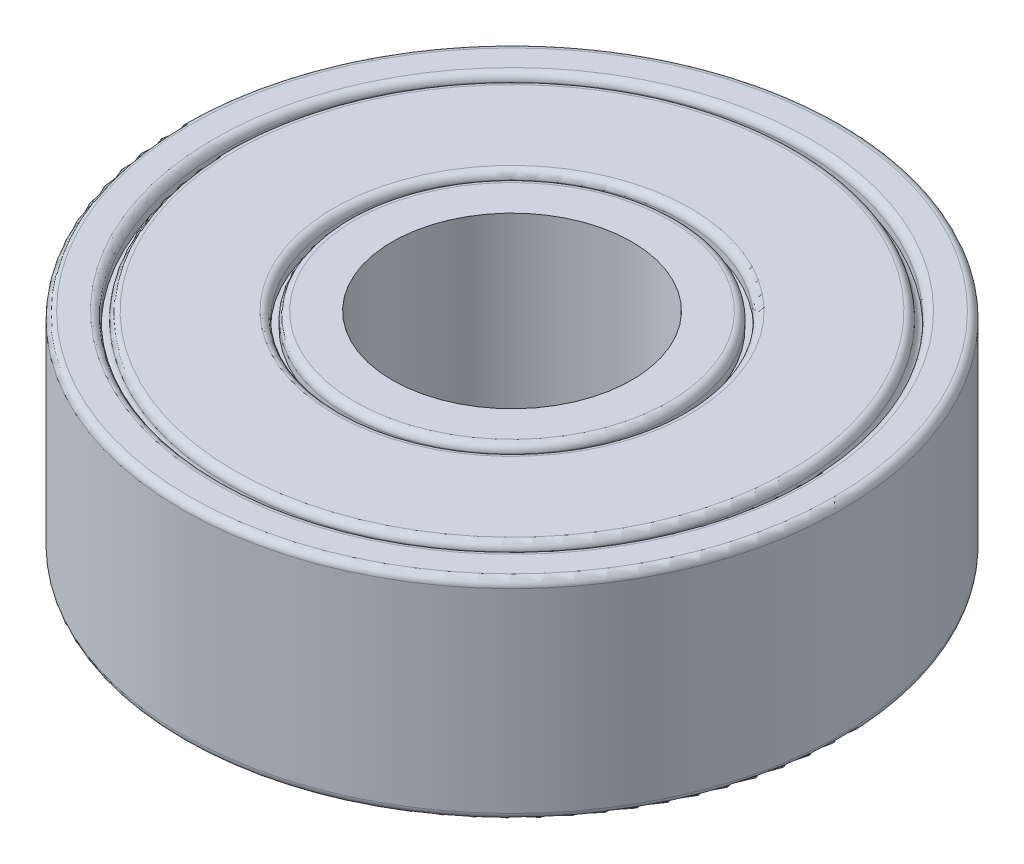
ISO-10303-21;
HEADER;
FILE_DESCRIPTION(('STEP AP214'),'2;1');
FILE_NAME('part.step','',(''),(''),'','','');
FILE_SCHEMA(('AUTOMOTIVE_DESIGN { 1 0 10303 214 1 1 1 1 }'));
ENDSEC;
DATA;
#1=APPLICATION_CONTEXT('core data for automotive mechanical design processes');
#2=APPLICATION_PROTOCOL_DEFINITION('international standard','automotive_design',2000,#1);
#3=PRODUCT_CONTEXT('',#1,'mechanical');
#4=PRODUCT('Part','Part','',(#3));
#5=PRODUCT_RELATED_PRODUCT_CATEGORY('part','',(#4));
#6=PRODUCT_DEFINITION_FORMATION('','',#4);
#7=PRODUCT_DEFINITION_CONTEXT('part definition',#1,'design');
#8=PRODUCT_DEFINITION('design','',#6,#7);
#9=PRODUCT_DEFINITION_SHAPE('','',#8);
#10=(LENGTH_UNIT() NAMED_UNIT(*) SI_UNIT(.MILLI.,.METRE.));
#11=(NAMED_UNIT(*) PLANE_ANGLE_UNIT() SI_UNIT($,.RADIAN.));
#12=(NAMED_UNIT(*) SI_UNIT($,.STERADIAN.) SOLID_ANGLE_UNIT());
#13=UNCERTAINTY_MEASURE_WITH_UNIT(LENGTH_MEASURE(1.E-05),#10,'distance_accuracy_value','');
#14=(GEOMETRIC_REPRESENTATION_CONTEXT(3) GLOBAL_UNCERTAINTY_ASSIGNED_CONTEXT((#13)) GLOBAL_UNIT_ASSIGNED_CONTEXT((#10,
#11,#12)) REPRESENTATION_CONTEXT('',''));
#15=CARTESIAN_POINT('',(0.,0.,0.));
#16=DIRECTION('',(0.,0.,1.));
#17=DIRECTION('',(1.,0.,0.));
#18=AXIS2_PLACEMENT_3D('',#15,#16,#17);
#19=CARTESIAN_POINT('',(0.,0.,0.));
#20=DIRECTION('',(0.,1.,0.));
#21=DIRECTION('',(0.,0.,1.));
#22=AXIS2_PLACEMENT_3D('',#19,#20,#21);
#23=PLANE('',#22);
#24=CARTESIAN_POINT('',(0.,0.,0.));
#25=DIRECTION('',(0.,1.,0.));
#26=DIRECTION('',(0.,0.,1.));
#27=AXIS2_PLACEMENT_3D('',#24,#25,#26);
#28=CIRCLE('',#27,5.25);
#29=CARTESIAN_POINT('',(0.,0.,5.25));
#30=VERTEX_POINT('',#29);
#31=EDGE_CURVE('E120',#30,#30,#28,.F.);
#32=ORIENTED_EDGE('',*,*,#31,.T.);
#33=EDGE_LOOP('',(#32));
#34=FACE_BOUND('',#33,.T.);
#35=CARTESIAN_POINT('',(0.,0.,0.));
#36=DIRECTION('',(0.,1.,0.));
#37=DIRECTION('',(0.,0.,1.));
#38=AXIS2_PLACEMENT_3D('',#35,#36,#37);
#39=CIRCLE('',#38,4.);
#40=CARTESIAN_POINT('',(0.,0.,4.));
#41=VERTEX_POINT('',#40);
#42=EDGE_CURVE('E142',#41,#41,#39,.T.);
#43=ORIENTED_EDGE('',*,*,#42,.T.);
#44=EDGE_LOOP('',(#43));
#45=FACE_BOUND('',#44,.T.);
#46=ADVANCED_FACE('F47',(#34,#45),#23,.F.);
#47=CARTESIAN_POINT('',(0.,0.,0.));
#48=DIRECTION('',(0.,1.,0.));
#49=DIRECTION('',(0.,0.,1.));
#50=AXIS2_PLACEMENT_3D('',#47,#48,#49);
#51=CIRCLE('',#50,5.95);
#52=CARTESIAN_POINT('',(0.,0.,5.95));
#53=VERTEX_POINT('',#52);
#54=EDGE_CURVE('E112',#53,#53,#51,.T.);
#55=ORIENTED_EDGE('',*,*,#54,.T.);
#56=EDGE_LOOP('',(#55));
#57=FACE_BOUND('',#56,.T.);
#58=CARTESIAN_POINT('',(0.,0.,0.));
#59=DIRECTION('',(0.,1.,0.));
#60=DIRECTION('',(0.,0.,1.));
#61=AXIS2_PLACEMENT_3D('',#58,#59,#60);
#62=CIRCLE('',#61,9.25);
#63=CARTESIAN_POINT('',(0.,0.,9.25));
#64=VERTEX_POINT('',#63);
#65=EDGE_CURVE('E116',#64,#64,#62,.F.);
#66=ORIENTED_EDGE('',*,*,#65,.T.);
#67=EDGE_LOOP('',(#66));
#68=FACE_BOUND('',#67,.T.);
#69=ADVANCED_FACE('F198',(#57,#68),#23,.F.);
#70=CARTESIAN_POINT('',(0.,7.,0.));
#71=DIRECTION('',(0.,1.,0.));
#72=DIRECTION('',(0.,0.,1.));
#73=AXIS2_PLACEMENT_3D('',#70,#71,#72);
#74=PLANE('',#73);
#75=CARTESIAN_POINT('',(0.,7.,0.));
#76=DIRECTION('',(0.,1.,0.));
#77=DIRECTION('',(0.,0.,1.));
#78=AXIS2_PLACEMENT_3D('',#75,#76,#77);
#79=CIRCLE('',#78,5.25);
#80=CARTESIAN_POINT('',(0.,7.,5.25));
#81=VERTEX_POINT('',#80);
#82=EDGE_CURVE('E93',#81,#81,#79,.T.);
#83=ORIENTED_EDGE('',*,*,#82,.T.);
#84=EDGE_LOOP('',(#83));
#85=FACE_BOUND('',#84,.T.);
#86=CARTESIAN_POINT('',(0.,7.,0.));
#87=DIRECTION('',(0.,1.,0.));
#88=DIRECTION('',(0.,0.,1.));
#89=AXIS2_PLACEMENT_3D('',#86,#87,#88);
#90=CIRCLE('',#89,4.);
#91=CARTESIAN_POINT('',(0.,7.,4.));
#92=VERTEX_POINT('',#91);
#93=EDGE_CURVE('E141',#92,#92,#90,.T.);
#94=ORIENTED_EDGE('',*,*,#93,.F.);
#95=EDGE_LOOP('',(#94));
#96=FACE_BOUND('',#95,.T.);
#97=ADVANCED_FACE('F205',(#85,#96),#74,.T.);
#98=CARTESIAN_POINT('',(0.,7.,0.));
#99=DIRECTION('',(0.,1.,0.));
#100=DIRECTION('',(0.,0.,1.));
#101=AXIS2_PLACEMENT_3D('',#98,#99,#100);
#102=CIRCLE('',#101,9.25);
#103=CARTESIAN_POINT('',(0.,7.,9.25));
#104=VERTEX_POINT('',#103);
#105=EDGE_CURVE('E134',#104,#104,#102,.T.);
#106=ORIENTED_EDGE('',*,*,#105,.T.);
#107=EDGE_LOOP('',(#106));
#108=FACE_BOUND('',#107,.T.);
#109=CARTESIAN_POINT('',(0.,7.,0.));
#110=DIRECTION('',(0.,1.,0.));
#111=DIRECTION('',(0.,0.,1.));
#112=AXIS2_PLACEMENT_3D('',#109,#110,#111);
#113=CIRCLE('',#112,5.95);
#114=CARTESIAN_POINT('',(0.,7.,5.95));
#115=VERTEX_POINT('',#114);
#116=EDGE_CURVE('E137',#115,#115,#113,.F.);
#117=ORIENTED_EDGE('',*,*,#116,.T.);
#118=EDGE_LOOP('',(#117));
#119=FACE_BOUND('',#118,.T.);
#120=ADVANCED_FACE('F218',(#108,#119),#74,.T.);
#121=CARTESIAN_POINT('',(0.,7.,0.));
#122=DIRECTION('',(0.,1.,0.));
#123=DIRECTION('',(0.,0.,1.));
#124=AXIS2_PLACEMENT_3D('',#121,#122,#123);
#125=CIRCLE('',#124,10.75);
#126=CARTESIAN_POINT('',(0.,7.,10.75));
#127=VERTEX_POINT('',#126);
#128=EDGE_CURVE('E71',#127,#127,#125,.T.);
#129=ORIENTED_EDGE('',*,*,#128,.T.);
#130=EDGE_LOOP('',(#129));
#131=FACE_BOUND('',#130,.T.);
#132=CARTESIAN_POINT('',(0.,7.,0.));
#133=DIRECTION('',(0.,1.,0.));
#134=DIRECTION('',(0.,0.,1.));
#135=AXIS2_PLACEMENT_3D('',#132,#133,#134);
#136=CIRCLE('',#135,9.95);
#137=CARTESIAN_POINT('',(0.,7.,9.95));
#138=VERTEX_POINT('',#137);
#139=EDGE_CURVE('E77',#138,#138,#136,.F.);
#140=ORIENTED_EDGE('',*,*,#139,.T.);
#141=EDGE_LOOP('',(#140));
#142=FACE_BOUND('',#141,.T.);
#143=ADVANCED_FACE('F212',(#131,#142),#74,.T.);
#144=CARTESIAN_POINT('',(0.,0.,0.));
#145=DIRECTION('',(0.,1.,0.));
#146=DIRECTION('',(0.,0.,1.));
#147=AXIS2_PLACEMENT_3D('',#144,#145,#146);
#148=CIRCLE('',#147,10.75);
#149=CARTESIAN_POINT('',(0.,0.,10.75));
#150=VERTEX_POINT('',#149);
#151=EDGE_CURVE('E11',#150,#150,#148,.F.);
#152=ORIENTED_EDGE('',*,*,#151,.T.);
#153=EDGE_LOOP('',(#152));
#154=FACE_BOUND('',#153,.T.);
#155=CARTESIAN_POINT('',(0.,0.,0.));
#156=DIRECTION('',(0.,1.,0.));
#157=DIRECTION('',(0.,0.,1.));
#158=AXIS2_PLACEMENT_3D('',#155,#156,#157);
#159=CIRCLE('',#158,9.95);
#160=CARTESIAN_POINT('',(0.,0.,9.95));
#161=VERTEX_POINT('',#160);
#162=EDGE_CURVE('E101',#161,#161,#159,.T.);
#163=ORIENTED_EDGE('',*,*,#162,.T.);
#164=EDGE_LOOP('',(#163));
#165=FACE_BOUND('',#164,.T.);
#166=ADVANCED_FACE('F201',(#154,#165),#23,.F.);
#167=CARTESIAN_POINT('',(0.,7.,0.));
#168=DIRECTION('',(0.,-1.,0.));
#169=DIRECTION('',(0.,0.,-1.));
#170=AXIS2_PLACEMENT_3D('',#167,#168,#169);
#171=CYLINDRICAL_SURFACE('',#170,11.);
#172=CARTESIAN_POINT('',(0.,6.75,0.));
#173=DIRECTION('',(0.,1.,0.));
#174=DIRECTION('',(0.,0.,1.));
#175=AXIS2_PLACEMENT_3D('',#172,#173,#174);
#176=CIRCLE('',#175,11.);
#177=CARTESIAN_POINT('',(0.,6.75,11.));
#178=VERTEX_POINT('',#177);
#179=EDGE_CURVE('E55',#178,#178,#176,.F.);
#180=ORIENTED_EDGE('',*,*,#179,.T.);
#181=EDGE_LOOP('',(#180));
#182=FACE_BOUND('',#181,.T.);
#183=CARTESIAN_POINT('',(0.,0.25,0.));
#184=DIRECTION('',(0.,1.,0.));
#185=DIRECTION('',(0.,0.,1.));
#186=AXIS2_PLACEMENT_3D('',#183,#184,#185);
#187=CIRCLE('',#186,11.);
#188=CARTESIAN_POINT('',(0.,0.25,11.));
#189=VERTEX_POINT('',#188);
#190=EDGE_CURVE('E63',#189,#189,#187,.T.);
#191=ORIENTED_EDGE('',*,*,#190,.T.);
#192=EDGE_LOOP('',(#191));
#193=FACE_BOUND('',#192,.T.);
#194=ADVANCED_FACE('F211',(#182,#193),#171,.T.);
#195=CARTESIAN_POINT('',(0.,7.,0.));
#196=DIRECTION('',(0.,-1.,0.));
#197=DIRECTION('',(0.,0.,-1.));
#198=AXIS2_PLACEMENT_3D('',#195,#196,#197);
#199=CYLINDRICAL_SURFACE('',#198,4.);
#200=ORIENTED_EDGE('',*,*,#93,.T.);
#201=EDGE_LOOP('',(#200));
#202=FACE_BOUND('',#201,.T.);
#203=ORIENTED_EDGE('',*,*,#42,.F.);
#204=EDGE_LOOP('',(#203));
#205=FACE_BOUND('',#204,.T.);
#206=ADVANCED_FACE('F217',(#202,#205),#199,.F.);
#207=CARTESIAN_POINT('',(0.,6.5,0.));
#208=DIRECTION('',(0.,1.,0.));
#209=DIRECTION('',(0.,0.,1.));
#210=AXIS2_PLACEMENT_3D('',#207,#208,#209);
#211=CYLINDRICAL_SURFACE('',#210,9.5);
#212=CARTESIAN_POINT('',(0.,6.75,0.));
#213=DIRECTION('',(0.,1.,0.));
#214=DIRECTION('',(0.,0.,1.));
#215=AXIS2_PLACEMENT_3D('',#212,#213,#214);
#216=CIRCLE('',#215,9.5);
#217=CARTESIAN_POINT('',(0.,6.75,9.5));
#218=VERTEX_POINT('',#217);
#219=EDGE_CURVE('E127',#218,#218,#216,.F.);
#220=ORIENTED_EDGE('',*,*,#219,.T.);
#221=EDGE_LOOP('',(#220));
#222=FACE_BOUND('',#221,.T.);
#223=CARTESIAN_POINT('',(0.,6.74494897427832,0.));
#224=DIRECTION('',(0.,-1.,0.));
#225=DIRECTION('',(0.,0.,-1.));
#226=AXIS2_PLACEMENT_3D('',#223,#224,#225);
#227=CIRCLE('',#226,9.5);
#228=CARTESIAN_POINT('',(0.,6.74494897427832,-9.5));
#229=VERTEX_POINT('',#228);
#230=EDGE_CURVE('E131',#229,#229,#227,.F.);
#231=ORIENTED_EDGE('',*,*,#230,.T.);
#232=EDGE_LOOP('',(#231));
#233=FACE_BOUND('',#232,.T.);
#234=ADVANCED_FACE('F266',(#222,#233),#211,.T.);
#235=CARTESIAN_POINT('',(0.,6.5,0.));
#236=DIRECTION('',(0.,1.,0.));
#237=DIRECTION('',(0.,0.,1.));
#238=AXIS2_PLACEMENT_3D('',#235,#236,#237);
#239=CYLINDRICAL_SURFACE('',#238,9.7);
#240=CARTESIAN_POINT('',(0.,6.75,0.));
#241=DIRECTION('',(0.,1.,0.));
#242=DIRECTION('',(0.,0.,1.));
#243=AXIS2_PLACEMENT_3D('',#240,#241,#242);
#244=CIRCLE('',#243,9.7);
#245=CARTESIAN_POINT('',(0.,6.75,9.7));
#246=VERTEX_POINT('',#245);
#247=EDGE_CURVE('E81',#246,#246,#244,.T.);
#248=ORIENTED_EDGE('',*,*,#247,.T.);
#249=EDGE_LOOP('',(#248));
#250=FACE_BOUND('',#249,.T.);
#251=CARTESIAN_POINT('',(0.,6.5,0.));
#252=DIRECTION('',(0.,1.,0.));
#253=DIRECTION('',(0.,0.,1.));
#254=AXIS2_PLACEMENT_3D('',#251,#252,#253);
#255=CIRCLE('',#254,9.7);
#256=CARTESIAN_POINT('',(0.,6.5,9.7));
#257=VERTEX_POINT('',#256);
#258=EDGE_CURVE('E146',#257,#257,#255,.T.);
#259=ORIENTED_EDGE('',*,*,#258,.F.);
#260=EDGE_LOOP('',(#259));
#261=FACE_BOUND('',#260,.T.);
#262=ADVANCED_FACE('F262',(#250,#261),#239,.F.);
#263=CARTESIAN_POINT('',(0.,6.5,0.));
#264=DIRECTION('',(0.,1.,0.));
#265=DIRECTION('',(0.,0.,1.));
#266=AXIS2_PLACEMENT_3D('',#263,#264,#265);
#267=CYLINDRICAL_SURFACE('',#266,5.5);
#268=CARTESIAN_POINT('',(0.,6.75,0.));
#269=DIRECTION('',(0.,1.,0.));
#270=DIRECTION('',(0.,0.,1.));
#271=AXIS2_PLACEMENT_3D('',#268,#269,#270);
#272=CIRCLE('',#271,5.5);
#273=CARTESIAN_POINT('',(0.,6.75,5.5));
#274=VERTEX_POINT('',#273);
#275=EDGE_CURVE('E89',#274,#274,#272,.F.);
#276=ORIENTED_EDGE('',*,*,#275,.T.);
#277=EDGE_LOOP('',(#276));
#278=FACE_BOUND('',#277,.T.);
#279=CARTESIAN_POINT('',(0.,6.5,0.));
#280=DIRECTION('',(0.,1.,0.));
#281=DIRECTION('',(0.,0.,1.));
#282=AXIS2_PLACEMENT_3D('',#279,#280,#281);
#283=CIRCLE('',#282,5.5);
#284=CARTESIAN_POINT('',(0.,6.5,5.5));
#285=VERTEX_POINT('',#284);
#286=EDGE_CURVE('E157',#285,#285,#283,.T.);
#287=ORIENTED_EDGE('',*,*,#286,.T.);
#288=EDGE_LOOP('',(#287));
#289=FACE_BOUND('',#288,.T.);
#290=ADVANCED_FACE('F265',(#278,#289),#267,.T.);
#291=CARTESIAN_POINT('',(0.,6.5,0.));
#292=DIRECTION('',(0.,1.,0.));
#293=DIRECTION('',(0.,0.,1.));
#294=AXIS2_PLACEMENT_3D('',#291,#292,#293);
#295=CYLINDRICAL_SURFACE('',#294,5.7);
#296=CARTESIAN_POINT('',(0.,6.75,0.));
#297=DIRECTION('',(0.,1.,0.));
#298=DIRECTION('',(0.,0.,1.));
#299=AXIS2_PLACEMENT_3D('',#296,#297,#298);
#300=CIRCLE('',#299,5.7);
#301=CARTESIAN_POINT('',(0.,6.75,5.7));
#302=VERTEX_POINT('',#301);
#303=EDGE_CURVE('E85',#302,#302,#300,.T.);
#304=ORIENTED_EDGE('',*,*,#303,.T.);
#305=EDGE_LOOP('',(#304));
#306=FACE_BOUND('',#305,.T.);
#307=CARTESIAN_POINT('',(0.,6.5,0.));
#308=DIRECTION('',(0.,1.,0.));
#309=DIRECTION('',(0.,0.,1.));
#310=AXIS2_PLACEMENT_3D('',#307,#308,#309);
#311=CIRCLE('',#310,5.7);
#312=CARTESIAN_POINT('',(0.,6.5,5.7));
#313=VERTEX_POINT('',#312);
#314=EDGE_CURVE('E153',#313,#313,#311,.T.);
#315=ORIENTED_EDGE('',*,*,#314,.F.);
#316=EDGE_LOOP('',(#315));
#317=FACE_BOUND('',#316,.T.);
#318=ADVANCED_FACE('F289',(#306,#317),#295,.F.);
#319=CARTESIAN_POINT('',(0.,6.5,0.));
#320=DIRECTION('',(0.,1.,0.));
#321=DIRECTION('',(0.,0.,1.));
#322=AXIS2_PLACEMENT_3D('',#319,#320,#321);
#323=PLANE('',#322);
#324=ORIENTED_EDGE('',*,*,#286,.F.);
#325=EDGE_LOOP('',(#324));
#326=FACE_BOUND('',#325,.T.);
#327=ORIENTED_EDGE('',*,*,#314,.T.);
#328=EDGE_LOOP('',(#327));
#329=FACE_BOUND('',#328,.T.);
#330=ADVANCED_FACE('F293',(#326,#329),#323,.T.);
#331=CARTESIAN_POINT('',(0.,0.5,0.));
#332=DIRECTION('',(0.,-1.,0.));
#333=DIRECTION('',(0.,0.,-1.));
#334=AXIS2_PLACEMENT_3D('',#331,#332,#333);
#335=CYLINDRICAL_SURFACE('',#334,9.5);
#336=CARTESIAN_POINT('',(0.,0.25,0.));
#337=DIRECTION('',(0.,1.,0.));
#338=DIRECTION('',(0.,0.,1.));
#339=AXIS2_PLACEMENT_3D('',#336,#337,#338);
#340=CIRCLE('',#339,9.5);
#341=CARTESIAN_POINT('',(0.,0.25,9.5));
#342=VERTEX_POINT('',#341);
#343=EDGE_CURVE('E105',#342,#342,#340,.T.);
#344=ORIENTED_EDGE('',*,*,#343,.T.);
#345=EDGE_LOOP('',(#344));
#346=FACE_BOUND('',#345,.T.);
#347=CARTESIAN_POINT('',(0.,0.5,0.));
#348=DIRECTION('',(0.,1.,0.));
#349=DIRECTION('',(0.,0.,1.));
#350=AXIS2_PLACEMENT_3D('',#347,#348,#349);
#351=CIRCLE('',#350,9.5);
#352=CARTESIAN_POINT('',(0.,0.5,9.5));
#353=VERTEX_POINT('',#352);
#354=EDGE_CURVE('E165',#353,#353,#351,.T.);
#355=ORIENTED_EDGE('',*,*,#354,.F.);
#356=EDGE_LOOP('',(#355));
#357=FACE_BOUND('',#356,.T.);
#358=ADVANCED_FACE('F297',(#346,#357),#335,.T.);
#359=CARTESIAN_POINT('',(0.,0.5,0.));
#360=DIRECTION('',(0.,-1.,0.));
#361=DIRECTION('',(0.,0.,-1.));
#362=AXIS2_PLACEMENT_3D('',#359,#360,#361);
#363=CYLINDRICAL_SURFACE('',#362,9.7);
#364=CARTESIAN_POINT('',(0.,0.25,0.));
#365=DIRECTION('',(0.,1.,0.));
#366=DIRECTION('',(0.,0.,1.));
#367=AXIS2_PLACEMENT_3D('',#364,#365,#366);
#368=CIRCLE('',#367,9.7);
#369=CARTESIAN_POINT('',(0.,0.25,9.7));
#370=VERTEX_POINT('',#369);
#371=EDGE_CURVE('E97',#370,#370,#368,.F.);
#372=ORIENTED_EDGE('',*,*,#371,.T.);
#373=EDGE_LOOP('',(#372));
#374=FACE_BOUND('',#373,.T.);
#375=CARTESIAN_POINT('',(0.,0.5,0.));
#376=DIRECTION('',(0.,1.,0.));
#377=DIRECTION('',(0.,0.,1.));
#378=AXIS2_PLACEMENT_3D('',#375,#376,#377);
#379=CIRCLE('',#378,9.7);
#380=CARTESIAN_POINT('',(0.,0.5,9.7));
#381=VERTEX_POINT('',#380);
#382=EDGE_CURVE('E161',#381,#381,#379,.T.);
#383=ORIENTED_EDGE('',*,*,#382,.T.);
#384=EDGE_LOOP('',(#383));
#385=FACE_BOUND('',#384,.T.);
#386=ADVANCED_FACE('F194',(#374,#385),#363,.F.);
#387=CARTESIAN_POINT('',(0.,0.5,0.));
#388=DIRECTION('',(0.,-1.,0.));
#389=DIRECTION('',(0.,0.,1.));
#390=AXIS2_PLACEMENT_3D('',#387,#388,#389);
#391=PLANE('',#390);
#392=ORIENTED_EDGE('',*,*,#354,.T.);
#393=EDGE_LOOP('',(#392));
#394=FACE_BOUND('',#393,.T.);
#395=ORIENTED_EDGE('',*,*,#382,.F.);
#396=EDGE_LOOP('',(#395));
#397=FACE_BOUND('',#396,.T.);
#398=ADVANCED_FACE('F185',(#394,#397),#391,.T.);
#399=CARTESIAN_POINT('',(0.,0.5,0.));
#400=DIRECTION('',(0.,-1.,0.));
#401=DIRECTION('',(0.,0.,-1.));
#402=AXIS2_PLACEMENT_3D('',#399,#400,#401);
#403=CYLINDRICAL_SURFACE('',#402,5.5);
#404=CARTESIAN_POINT('',(0.,0.25,0.));
#405=DIRECTION('',(0.,1.,0.));
#406=DIRECTION('',(0.,0.,1.));
#407=AXIS2_PLACEMENT_3D('',#404,#405,#406);
#408=CIRCLE('',#407,5.5);
#409=CARTESIAN_POINT('',(0.,0.25,5.5));
#410=VERTEX_POINT('',#409);
#411=EDGE_CURVE('E124',#410,#410,#408,.T.);
#412=ORIENTED_EDGE('',*,*,#411,.T.);
#413=EDGE_LOOP('',(#412));
#414=FACE_BOUND('',#413,.T.);
#415=CARTESIAN_POINT('',(0.,0.5,0.));
#416=DIRECTION('',(0.,1.,0.));
#417=DIRECTION('',(0.,0.,1.));
#418=AXIS2_PLACEMENT_3D('',#415,#416,#417);
#419=CIRCLE('',#418,5.5);
#420=CARTESIAN_POINT('',(0.,0.5,5.5));
#421=VERTEX_POINT('',#420);
#422=EDGE_CURVE('E173',#421,#421,#419,.T.);
#423=ORIENTED_EDGE('',*,*,#422,.F.);
#424=EDGE_LOOP('',(#423));
#425=FACE_BOUND('',#424,.T.);
#426=ADVANCED_FACE('F182',(#414,#425),#403,.T.);
#427=CARTESIAN_POINT('',(0.,0.5,0.));
#428=DIRECTION('',(0.,-1.,0.));
#429=DIRECTION('',(0.,0.,-1.));
#430=AXIS2_PLACEMENT_3D('',#427,#428,#429);
#431=CYLINDRICAL_SURFACE('',#430,5.7);
#432=CARTESIAN_POINT('',(0.,0.25,0.));
#433=DIRECTION('',(0.,1.,0.));
#434=DIRECTION('',(0.,0.,1.));
#435=AXIS2_PLACEMENT_3D('',#432,#433,#434);
#436=CIRCLE('',#435,5.7);
#437=CARTESIAN_POINT('',(0.,0.25,5.7));
#438=VERTEX_POINT('',#437);
#439=EDGE_CURVE('E109',#438,#438,#436,.F.);
#440=ORIENTED_EDGE('',*,*,#439,.T.);
#441=EDGE_LOOP('',(#440));
#442=FACE_BOUND('',#441,.T.);
#443=CARTESIAN_POINT('',(0.,0.5,0.));
#444=DIRECTION('',(0.,1.,0.));
#445=DIRECTION('',(0.,0.,1.));
#446=AXIS2_PLACEMENT_3D('',#443,#444,#445);
#447=CIRCLE('',#446,5.7);
#448=CARTESIAN_POINT('',(0.,0.5,5.7));
#449=VERTEX_POINT('',#448);
#450=EDGE_CURVE('E169',#449,#449,#447,.T.);
#451=ORIENTED_EDGE('',*,*,#450,.T.);
#452=EDGE_LOOP('',(#451));
#453=FACE_BOUND('',#452,.T.);
#454=ADVANCED_FACE('F184',(#442,#453),#431,.F.);
#455=CARTESIAN_POINT('',(0.,0.5,0.));
#456=DIRECTION('',(0.,-1.,0.));
#457=DIRECTION('',(0.,0.,1.));
#458=AXIS2_PLACEMENT_3D('',#455,#456,#457);
#459=PLANE('',#458);
#460=ORIENTED_EDGE('',*,*,#422,.T.);
#461=EDGE_LOOP('',(#460));
#462=FACE_BOUND('',#461,.T.);
#463=ORIENTED_EDGE('',*,*,#450,.F.);
#464=EDGE_LOOP('',(#463));
#465=FACE_BOUND('',#464,.T.);
#466=ADVANCED_FACE('F179',(#462,#465),#459,.T.);
#467=CARTESIAN_POINT('',(0.,6.75,0.));
#468=DIRECTION('',(0.,1.,0.));
#469=DIRECTION('',(0.,0.,1.));
#470=AXIS2_PLACEMENT_3D('',#467,#468,#469);
#471=TOROIDAL_SURFACE('',#470,9.25,0.25);
#472=ORIENTED_EDGE('',*,*,#219,.F.);
#473=EDGE_LOOP('',(#472));
#474=FACE_BOUND('',#473,.T.);
#475=ORIENTED_EDGE('',*,*,#105,.F.);
#476=EDGE_LOOP('',(#475));
#477=FACE_BOUND('',#476,.T.);
#478=ADVANCED_FACE('F274',(#474,#477),#471,.T.);
#479=CARTESIAN_POINT('',(0.,6.74494897427832,0.));
#480=DIRECTION('',(0.,-1.,0.));
#481=DIRECTION('',(0.,0.,-1.));
#482=AXIS2_PLACEMENT_3D('',#479,#480,#481);
#483=TOROIDAL_SURFACE('',#482,9.75,0.25);
#484=ORIENTED_EDGE('',*,*,#258,.T.);
#485=EDGE_LOOP('',(#484));
#486=FACE_BOUND('',#485,.T.);
#487=ORIENTED_EDGE('',*,*,#230,.F.);
#488=EDGE_LOOP('',(#487));
#489=FACE_BOUND('',#488,.T.);
#490=ADVANCED_FACE('F270',(#486,#489),#483,.F.);
#491=CARTESIAN_POINT('',(0.,0.25,0.));
#492=DIRECTION('',(0.,1.,0.));
#493=DIRECTION('',(0.,0.,1.));
#494=AXIS2_PLACEMENT_3D('',#491,#492,#493);
#495=TOROIDAL_SURFACE('',#494,5.25,0.25);
#496=ORIENTED_EDGE('',*,*,#31,.F.);
#497=EDGE_LOOP('',(#496));
#498=FACE_BOUND('',#497,.T.);
#499=ORIENTED_EDGE('',*,*,#411,.F.);
#500=EDGE_LOOP('',(#499));
#501=FACE_BOUND('',#500,.T.);
#502=ADVANCED_FACE('F273',(#498,#501),#495,.T.);
#503=CARTESIAN_POINT('',(0.,0.25,0.));
#504=DIRECTION('',(0.,1.,0.));
#505=DIRECTION('',(0.,0.,1.));
#506=AXIS2_PLACEMENT_3D('',#503,#504,#505);
#507=TOROIDAL_SURFACE('',#506,5.95,0.25);
#508=ORIENTED_EDGE('',*,*,#439,.F.);
#509=EDGE_LOOP('',(#508));
#510=FACE_BOUND('',#509,.T.);
#511=ORIENTED_EDGE('',*,*,#54,.F.);
#512=EDGE_LOOP('',(#511));
#513=FACE_BOUND('',#512,.T.);
#514=ADVANCED_FACE('F236',(#510,#513),#507,.T.);
#515=CARTESIAN_POINT('',(0.,0.25,0.));
#516=DIRECTION('',(0.,1.,0.));
#517=DIRECTION('',(0.,0.,1.));
#518=AXIS2_PLACEMENT_3D('',#515,#516,#517);
#519=TOROIDAL_SURFACE('',#518,9.25,0.25);
#520=ORIENTED_EDGE('',*,*,#65,.F.);
#521=EDGE_LOOP('',(#520));
#522=FACE_BOUND('',#521,.T.);
#523=ORIENTED_EDGE('',*,*,#343,.F.);
#524=EDGE_LOOP('',(#523));
#525=FACE_BOUND('',#524,.T.);
#526=ADVANCED_FACE('F226',(#522,#525),#519,.T.);
#527=CARTESIAN_POINT('',(0.,0.25,0.));
#528=DIRECTION('',(0.,1.,0.));
#529=DIRECTION('',(0.,0.,1.));
#530=AXIS2_PLACEMENT_3D('',#527,#528,#529);
#531=TOROIDAL_SURFACE('',#530,9.95,0.25);
#532=ORIENTED_EDGE('',*,*,#371,.F.);
#533=EDGE_LOOP('',(#532));
#534=FACE_BOUND('',#533,.T.);
#535=ORIENTED_EDGE('',*,*,#162,.F.);
#536=EDGE_LOOP('',(#535));
#537=FACE_BOUND('',#536,.T.);
#538=ADVANCED_FACE('F223',(#534,#537),#531,.T.);
#539=CARTESIAN_POINT('',(0.,6.75,0.));
#540=DIRECTION('',(0.,1.,0.));
#541=DIRECTION('',(0.,0.,1.));
#542=AXIS2_PLACEMENT_3D('',#539,#540,#541);
#543=TOROIDAL_SURFACE('',#542,5.25,0.25);
#544=ORIENTED_EDGE('',*,*,#275,.F.);
#545=EDGE_LOOP('',(#544));
#546=FACE_BOUND('',#545,.T.);
#547=ORIENTED_EDGE('',*,*,#82,.F.);
#548=EDGE_LOOP('',(#547));
#549=FACE_BOUND('',#548,.T.);
#550=ADVANCED_FACE('F225',(#546,#549),#543,.T.);
#551=CARTESIAN_POINT('',(0.,6.75,0.));
#552=DIRECTION('',(0.,1.,0.));
#553=DIRECTION('',(0.,0.,1.));
#554=AXIS2_PLACEMENT_3D('',#551,#552,#553);
#555=TOROIDAL_SURFACE('',#554,5.95,0.25);
#556=ORIENTED_EDGE('',*,*,#116,.F.);
#557=EDGE_LOOP('',(#556));
#558=FACE_BOUND('',#557,.T.);
#559=ORIENTED_EDGE('',*,*,#303,.F.);
#560=EDGE_LOOP('',(#559));
#561=FACE_BOUND('',#560,.T.);
#562=ADVANCED_FACE('F233',(#558,#561),#555,.T.);
#563=CARTESIAN_POINT('',(0.,6.75,0.));
#564=DIRECTION('',(0.,1.,0.));
#565=DIRECTION('',(0.,0.,1.));
#566=AXIS2_PLACEMENT_3D('',#563,#564,#565);
#567=TOROIDAL_SURFACE('',#566,9.95,0.25);
#568=ORIENTED_EDGE('',*,*,#139,.F.);
#569=EDGE_LOOP('',(#568));
#570=FACE_BOUND('',#569,.T.);
#571=ORIENTED_EDGE('',*,*,#247,.F.);
#572=EDGE_LOOP('',(#571));
#573=FACE_BOUND('',#572,.T.);
#574=ADVANCED_FACE('F244',(#570,#573),#567,.T.);
#575=CARTESIAN_POINT('',(0.,6.75,0.));
#576=DIRECTION('',(0.,1.,0.));
#577=DIRECTION('',(0.,0.,1.));
#578=AXIS2_PLACEMENT_3D('',#575,#576,#577);
#579=TOROIDAL_SURFACE('',#578,10.75,0.25);
#580=ORIENTED_EDGE('',*,*,#179,.F.);
#581=EDGE_LOOP('',(#580));
#582=FACE_BOUND('',#581,.T.);
#583=ORIENTED_EDGE('',*,*,#128,.F.);
#584=EDGE_LOOP('',(#583));
#585=FACE_BOUND('',#584,.T.);
#586=ADVANCED_FACE('F247',(#582,#585),#579,.T.);
#587=CARTESIAN_POINT('',(0.,0.25,0.));
#588=DIRECTION('',(0.,1.,0.));
#589=DIRECTION('',(0.,0.,1.));
#590=AXIS2_PLACEMENT_3D('',#587,#588,#589);
#591=TOROIDAL_SURFACE('',#590,10.75,0.25);
#592=ORIENTED_EDGE('',*,*,#151,.F.);
#593=EDGE_LOOP('',(#592));
#594=FACE_BOUND('',#593,.T.);
#595=ORIENTED_EDGE('',*,*,#190,.F.);
#596=EDGE_LOOP('',(#595));
#597=FACE_BOUND('',#596,.T.);
#598=ADVANCED_FACE('F49',(#594,#597),#591,.T.);
#599=CLOSED_SHELL('',(#46,#69,#97,#120,#143,#166,#194,#206,#234,#262,#290,#318,#330,#358,#386,
#398,#426,#454,#466,#478,#490,#502,#514,#526,#538,#550,#562,#574,#586,#598));
#600=MANIFOLD_SOLID_BREP('B2',#599);
#601=ADVANCED_BREP_SHAPE_REPRESENTATION('',(#18,#600),#14);
#602=SHAPE_DEFINITION_REPRESENTATION(#9,#601);
ENDSEC;
END-ISO-10303-21;
